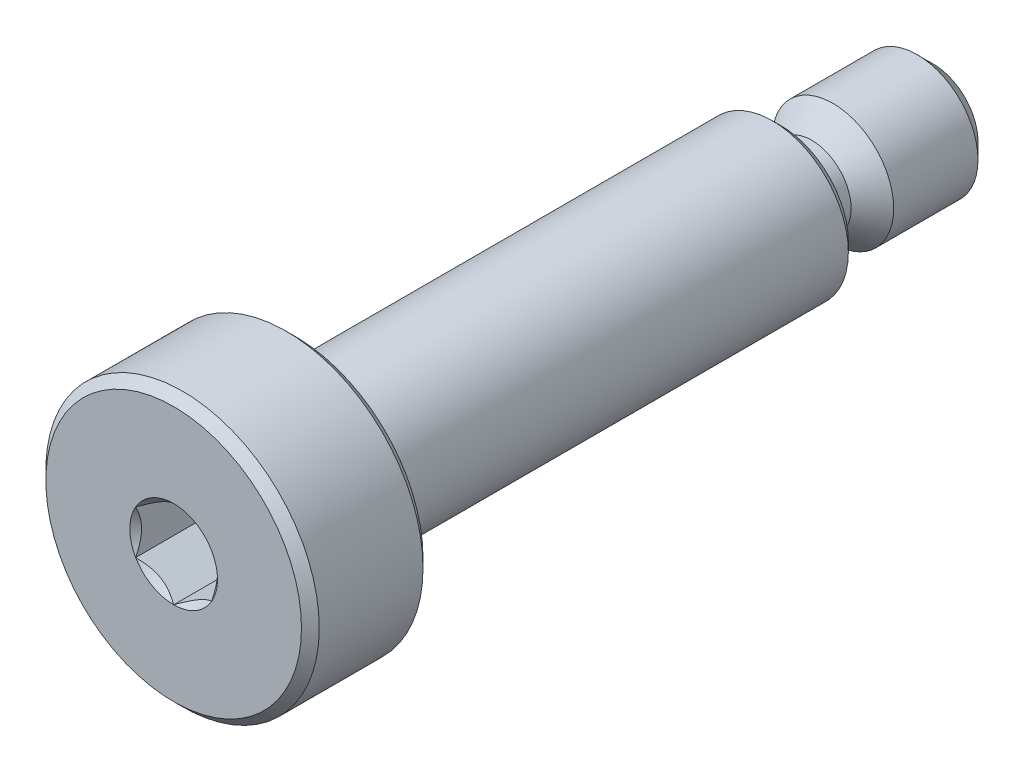
ISO-10303-21;
HEADER;
FILE_DESCRIPTION(('STEP AP214'),'2;1');
FILE_NAME('part.step','',(''),(''),'','','');
FILE_SCHEMA(('AUTOMOTIVE_DESIGN { 1 0 10303 214 1 1 1 1 }'));
ENDSEC;
DATA;
#1=APPLICATION_CONTEXT('core data for automotive mechanical design processes');
#2=APPLICATION_PROTOCOL_DEFINITION('international standard','automotive_design',2000,#1);
#3=PRODUCT_CONTEXT('',#1,'mechanical');
#4=PRODUCT('Part','Part','',(#3));
#5=PRODUCT_RELATED_PRODUCT_CATEGORY('part','',(#4));
#6=PRODUCT_DEFINITION_FORMATION('','',#4);
#7=PRODUCT_DEFINITION_CONTEXT('part definition',#1,'design');
#8=PRODUCT_DEFINITION('design','',#6,#7);
#9=PRODUCT_DEFINITION_SHAPE('','',#8);
#10=(LENGTH_UNIT() NAMED_UNIT(*) SI_UNIT(.MILLI.,.METRE.));
#11=(NAMED_UNIT(*) PLANE_ANGLE_UNIT() SI_UNIT($,.RADIAN.));
#12=(NAMED_UNIT(*) SI_UNIT($,.STERADIAN.) SOLID_ANGLE_UNIT());
#13=UNCERTAINTY_MEASURE_WITH_UNIT(LENGTH_MEASURE(1.E-05),#10,'distance_accuracy_value','');
#14=(GEOMETRIC_REPRESENTATION_CONTEXT(3) GLOBAL_UNCERTAINTY_ASSIGNED_CONTEXT((#13)) GLOBAL_UNIT_ASSIGNED_CONTEXT((#10,
#11,#12)) REPRESENTATION_CONTEXT('',''));
#15=CARTESIAN_POINT('',(0.,0.,0.));
#16=DIRECTION('',(0.,0.,1.));
#17=DIRECTION('',(1.,0.,0.));
#18=AXIS2_PLACEMENT_3D('',#15,#16,#17);
#19=CARTESIAN_POINT('',(0.,1.47500000000001,-12.5));
#20=DIRECTION('',(0.,0.,1.));
#21=DIRECTION('',(1.,0.,0.));
#22=AXIS2_PLACEMENT_3D('',#19,#20,#21);
#23=PLANE('',#22);
#24=CARTESIAN_POINT('',(0.,0.,-12.5));
#25=DIRECTION('',(0.,0.,1.));
#26=DIRECTION('',(1.,0.,0.));
#27=AXIS2_PLACEMENT_3D('',#24,#25,#26);
#28=CIRCLE('',#27,1.47500000000001);
#29=CARTESIAN_POINT('',(1.47500000000001,0.,-12.5));
#30=VERTEX_POINT('',#29);
#31=EDGE_CURVE('E107',#30,#30,#28,.T.);
#32=ORIENTED_EDGE('',*,*,#31,.F.);
#33=EDGE_LOOP('',(#32));
#34=FACE_BOUND('',#33,.T.);
#35=ADVANCED_FACE('F35',(#34),#23,.F.);
#36=CARTESIAN_POINT('',(0.,0.,-12.5));
#37=DIRECTION('',(0.,0.,1.));
#38=DIRECTION('',(1.,0.,0.));
#39=AXIS2_PLACEMENT_3D('',#36,#37,#38);
#40=CONICAL_SURFACE('',#39,1.47500000000001,0.785398163397443);
#41=CARTESIAN_POINT('',(0.,0.,-11.975));
#42=DIRECTION('',(0.,0.,1.));
#43=DIRECTION('',(1.,0.,0.));
#44=AXIS2_PLACEMENT_3D('',#41,#42,#43);
#45=CIRCLE('',#44,2.);
#46=CARTESIAN_POINT('',(2.,0.,-11.975));
#47=VERTEX_POINT('',#46);
#48=EDGE_CURVE('E321',#47,#47,#45,.T.);
#49=ORIENTED_EDGE('',*,*,#48,.F.);
#50=EDGE_LOOP('',(#49));
#51=FACE_BOUND('',#50,.T.);
#52=ORIENTED_EDGE('',*,*,#31,.T.);
#53=EDGE_LOOP('',(#52));
#54=FACE_BOUND('',#53,.T.);
#55=ADVANCED_FACE('F184',(#51,#54),#40,.T.);
#56=CARTESIAN_POINT('',(0.,0.,12.5));
#57=DIRECTION('',(0.,0.,1.));
#58=DIRECTION('',(1.,0.,0.));
#59=AXIS2_PLACEMENT_3D('',#56,#57,#58);
#60=CYLINDRICAL_SURFACE('',#59,2.);
#61=CARTESIAN_POINT('',(0.,0.,-9.2));
#62=DIRECTION('',(0.,0.,1.));
#63=DIRECTION('',(1.,0.,0.));
#64=AXIS2_PLACEMENT_3D('',#61,#62,#63);
#65=CIRCLE('',#64,2.);
#66=CARTESIAN_POINT('',(2.,0.,-9.2));
#67=VERTEX_POINT('',#66);
#68=EDGE_CURVE('E319',#67,#67,#65,.T.);
#69=ORIENTED_EDGE('',*,*,#68,.F.);
#70=EDGE_LOOP('',(#69));
#71=FACE_BOUND('',#70,.T.);
#72=ORIENTED_EDGE('',*,*,#48,.T.);
#73=EDGE_LOOP('',(#72));
#74=FACE_BOUND('',#73,.T.);
#75=ADVANCED_FACE('F189',(#71,#74),#60,.T.);
#76=CARTESIAN_POINT('',(0.,0.,-9.2));
#77=DIRECTION('',(0.,0.,-1.));
#78=DIRECTION('',(-1.,0.,0.));
#79=AXIS2_PLACEMENT_3D('',#76,#77,#78);
#80=CONICAL_SURFACE('',#79,2.,0.785398163397452);
#81=CARTESIAN_POINT('',(0.,0.,-8.5));
#82=DIRECTION('',(0.,0.,1.));
#83=DIRECTION('',(1.,0.,0.));
#84=AXIS2_PLACEMENT_3D('',#81,#82,#83);
#85=CIRCLE('',#84,1.3);
#86=CARTESIAN_POINT('',(1.3,0.,-8.5));
#87=VERTEX_POINT('',#86);
#88=EDGE_CURVE('E316',#87,#87,#85,.T.);
#89=ORIENTED_EDGE('',*,*,#88,.F.);
#90=EDGE_LOOP('',(#89));
#91=FACE_BOUND('',#90,.T.);
#92=ORIENTED_EDGE('',*,*,#68,.T.);
#93=EDGE_LOOP('',(#92));
#94=FACE_BOUND('',#93,.T.);
#95=ADVANCED_FACE('F196',(#91,#94),#80,.T.);
#96=CARTESIAN_POINT('',(0.,0.,12.5));
#97=DIRECTION('',(0.,0.,1.));
#98=DIRECTION('',(1.,0.,0.));
#99=AXIS2_PLACEMENT_3D('',#96,#97,#98);
#100=CYLINDRICAL_SURFACE('',#99,1.3);
#101=CARTESIAN_POINT('',(0.,0.,-7.85));
#102=DIRECTION('',(0.,0.,1.));
#103=DIRECTION('',(1.,0.,0.));
#104=AXIS2_PLACEMENT_3D('',#101,#102,#103);
#105=CIRCLE('',#104,1.3);
#106=CARTESIAN_POINT('',(1.3,0.,-7.85));
#107=VERTEX_POINT('',#106);
#108=EDGE_CURVE('E313',#107,#107,#105,.T.);
#109=ORIENTED_EDGE('',*,*,#108,.F.);
#110=EDGE_LOOP('',(#109));
#111=FACE_BOUND('',#110,.T.);
#112=ORIENTED_EDGE('',*,*,#88,.T.);
#113=EDGE_LOOP('',(#112));
#114=FACE_BOUND('',#113,.T.);
#115=ADVANCED_FACE('F200',(#111,#114),#100,.T.);
#116=CARTESIAN_POINT('',(0.,0.,-7.85));
#117=DIRECTION('',(0.,0.,1.));
#118=DIRECTION('',(1.,0.,0.));
#119=AXIS2_PLACEMENT_3D('',#116,#117,#118);
#120=TOROIDAL_SURFACE('',#119,1.65,0.35);
#121=CARTESIAN_POINT('',(0.,0.,-7.5));
#122=DIRECTION('',(0.,0.,1.));
#123=DIRECTION('',(1.,0.,0.));
#124=AXIS2_PLACEMENT_3D('',#121,#122,#123);
#125=CIRCLE('',#124,1.65);
#126=CARTESIAN_POINT('',(1.65,0.,-7.5));
#127=VERTEX_POINT('',#126);
#128=EDGE_CURVE('E310',#127,#127,#125,.T.);
#129=ORIENTED_EDGE('',*,*,#128,.F.);
#130=EDGE_LOOP('',(#129));
#131=FACE_BOUND('',#130,.T.);
#132=ORIENTED_EDGE('',*,*,#108,.T.);
#133=EDGE_LOOP('',(#132));
#134=FACE_BOUND('',#133,.T.);
#135=ADVANCED_FACE('F204',(#131,#134),#120,.F.);
#136=CARTESIAN_POINT('',(0.,2.5,-7.5));
#137=DIRECTION('',(0.,0.,1.));
#138=DIRECTION('',(1.,0.,0.));
#139=AXIS2_PLACEMENT_3D('',#136,#137,#138);
#140=PLANE('',#139);
#141=CARTESIAN_POINT('',(0.,0.,-7.5));
#142=DIRECTION('',(0.,0.,1.));
#143=DIRECTION('',(1.,0.,0.));
#144=AXIS2_PLACEMENT_3D('',#141,#142,#143);
#145=CIRCLE('',#144,2.2075);
#146=CARTESIAN_POINT('',(2.2075,0.,-7.5));
#147=VERTEX_POINT('',#146);
#148=EDGE_CURVE('E11',#147,#147,#145,.F.);
#149=ORIENTED_EDGE('',*,*,#148,.T.);
#150=EDGE_LOOP('',(#149));
#151=FACE_BOUND('',#150,.T.);
#152=ORIENTED_EDGE('',*,*,#128,.T.);
#153=EDGE_LOOP('',(#152));
#154=FACE_BOUND('',#153,.T.);
#155=ADVANCED_FACE('F208',(#151,#154),#140,.F.);
#156=CARTESIAN_POINT('',(0.,0.,12.5));
#157=DIRECTION('',(0.,0.,1.));
#158=DIRECTION('',(1.,0.,0.));
#159=AXIS2_PLACEMENT_3D('',#156,#157,#158);
#160=CYLINDRICAL_SURFACE('',#159,2.5);
#161=CARTESIAN_POINT('',(0.,0.,-7.2075));
#162=DIRECTION('',(0.,0.,1.));
#163=DIRECTION('',(1.,0.,0.));
#164=AXIS2_PLACEMENT_3D('',#161,#162,#163);
#165=CIRCLE('',#164,2.5);
#166=CARTESIAN_POINT('',(2.5,0.,-7.2075));
#167=VERTEX_POINT('',#166);
#168=EDGE_CURVE('E43',#167,#167,#165,.T.);
#169=ORIENTED_EDGE('',*,*,#168,.T.);
#170=EDGE_LOOP('',(#169));
#171=FACE_BOUND('',#170,.T.);
#172=CARTESIAN_POINT('',(0.,0.,7.789));
#173=DIRECTION('',(0.,0.,1.));
#174=DIRECTION('',(1.,0.,0.));
#175=AXIS2_PLACEMENT_3D('',#172,#173,#174);
#176=CIRCLE('',#175,2.5);
#177=CARTESIAN_POINT('',(2.5,0.,7.789));
#178=VERTEX_POINT('',#177);
#179=EDGE_CURVE('E307',#178,#178,#176,.T.);
#180=ORIENTED_EDGE('',*,*,#179,.F.);
#181=EDGE_LOOP('',(#180));
#182=FACE_BOUND('',#181,.T.);
#183=ADVANCED_FACE('F173',(#171,#182),#160,.T.);
#184=CARTESIAN_POINT('',(0.,0.,7.789));
#185=DIRECTION('',(0.,0.,-1.));
#186=DIRECTION('',(-1.,0.,0.));
#187=AXIS2_PLACEMENT_3D('',#184,#185,#186);
#188=CONICAL_SURFACE('',#187,2.5,0.785398163397453);
#189=CARTESIAN_POINT('',(0.,0.,7.992));
#190=DIRECTION('',(0.,0.,1.));
#191=DIRECTION('',(1.,0.,0.));
#192=AXIS2_PLACEMENT_3D('',#189,#190,#191);
#193=CIRCLE('',#192,2.297);
#194=CARTESIAN_POINT('',(2.297,0.,7.992));
#195=VERTEX_POINT('',#194);
#196=EDGE_CURVE('E304',#195,#195,#193,.T.);
#197=ORIENTED_EDGE('',*,*,#196,.F.);
#198=EDGE_LOOP('',(#197));
#199=FACE_BOUND('',#198,.T.);
#200=ORIENTED_EDGE('',*,*,#179,.T.);
#201=EDGE_LOOP('',(#200));
#202=FACE_BOUND('',#201,.T.);
#203=ADVANCED_FACE('F215',(#199,#202),#188,.T.);
#204=CARTESIAN_POINT('',(0.,0.,12.5));
#205=DIRECTION('',(0.,0.,1.));
#206=DIRECTION('',(1.,0.,0.));
#207=AXIS2_PLACEMENT_3D('',#204,#205,#206);
#208=CYLINDRICAL_SURFACE('',#207,2.297);
#209=CARTESIAN_POINT('',(0.,0.,8.5));
#210=DIRECTION('',(0.,0.,1.));
#211=DIRECTION('',(1.,0.,0.));
#212=AXIS2_PLACEMENT_3D('',#209,#210,#211);
#213=CIRCLE('',#212,2.297);
#214=CARTESIAN_POINT('',(2.297,0.,8.5));
#215=VERTEX_POINT('',#214);
#216=EDGE_CURVE('E301',#215,#215,#213,.T.);
#217=ORIENTED_EDGE('',*,*,#216,.F.);
#218=EDGE_LOOP('',(#217));
#219=FACE_BOUND('',#218,.T.);
#220=ORIENTED_EDGE('',*,*,#196,.T.);
#221=EDGE_LOOP('',(#220));
#222=FACE_BOUND('',#221,.T.);
#223=ADVANCED_FACE('F218',(#219,#222),#208,.T.);
#224=CARTESIAN_POINT('',(0.,4.2075,8.5));
#225=DIRECTION('',(0.,0.,1.));
#226=DIRECTION('',(1.,0.,0.));
#227=AXIS2_PLACEMENT_3D('',#224,#225,#226);
#228=PLANE('',#227);
#229=CARTESIAN_POINT('',(0.,0.,8.5));
#230=DIRECTION('',(0.,0.,1.));
#231=DIRECTION('',(1.,0.,0.));
#232=AXIS2_PLACEMENT_3D('',#229,#230,#231);
#233=CIRCLE('',#232,4.2075);
#234=CARTESIAN_POINT('',(4.2075,0.,8.5));
#235=VERTEX_POINT('',#234);
#236=EDGE_CURVE('E298',#235,#235,#233,.T.);
#237=ORIENTED_EDGE('',*,*,#236,.F.);
#238=EDGE_LOOP('',(#237));
#239=FACE_BOUND('',#238,.T.);
#240=ORIENTED_EDGE('',*,*,#216,.T.);
#241=EDGE_LOOP('',(#240));
#242=FACE_BOUND('',#241,.T.);
#243=ADVANCED_FACE('F222',(#239,#242),#228,.F.);
#244=CARTESIAN_POINT('',(0.,0.,8.5));
#245=DIRECTION('',(0.,0.,1.));
#246=DIRECTION('',(1.,0.,0.));
#247=AXIS2_PLACEMENT_3D('',#244,#245,#246);
#248=CONICAL_SURFACE('',#247,4.2075,0.785398163397444);
#249=CARTESIAN_POINT('',(0.,0.,8.7925));
#250=DIRECTION('',(0.,0.,1.));
#251=DIRECTION('',(1.,0.,0.));
#252=AXIS2_PLACEMENT_3D('',#249,#250,#251);
#253=CIRCLE('',#252,4.5);
#254=CARTESIAN_POINT('',(4.5,0.,8.7925));
#255=VERTEX_POINT('',#254);
#256=EDGE_CURVE('E295',#255,#255,#253,.T.);
#257=ORIENTED_EDGE('',*,*,#256,.F.);
#258=EDGE_LOOP('',(#257));
#259=FACE_BOUND('',#258,.T.);
#260=ORIENTED_EDGE('',*,*,#236,.T.);
#261=EDGE_LOOP('',(#260));
#262=FACE_BOUND('',#261,.T.);
#263=ADVANCED_FACE('F226',(#259,#262),#248,.T.);
#264=CARTESIAN_POINT('',(0.,0.,12.5));
#265=DIRECTION('',(0.,0.,1.));
#266=DIRECTION('',(1.,0.,0.));
#267=AXIS2_PLACEMENT_3D('',#264,#265,#266);
#268=CYLINDRICAL_SURFACE('',#267,4.5);
#269=CARTESIAN_POINT('',(0.,0.,12.2075));
#270=DIRECTION('',(0.,0.,1.));
#271=DIRECTION('',(1.,0.,0.));
#272=AXIS2_PLACEMENT_3D('',#269,#270,#271);
#273=CIRCLE('',#272,4.5);
#274=CARTESIAN_POINT('',(4.5,0.,12.2075));
#275=VERTEX_POINT('',#274);
#276=EDGE_CURVE('E292',#275,#275,#273,.T.);
#277=ORIENTED_EDGE('',*,*,#276,.F.);
#278=EDGE_LOOP('',(#277));
#279=FACE_BOUND('',#278,.T.);
#280=ORIENTED_EDGE('',*,*,#256,.T.);
#281=EDGE_LOOP('',(#280));
#282=FACE_BOUND('',#281,.T.);
#283=ADVANCED_FACE('F230',(#279,#282),#268,.T.);
#284=CARTESIAN_POINT('',(0.,0.,12.2075));
#285=DIRECTION('',(0.,0.,-1.));
#286=DIRECTION('',(-1.,0.,0.));
#287=AXIS2_PLACEMENT_3D('',#284,#285,#286);
#288=CONICAL_SURFACE('',#287,4.5,0.785398163397453);
#289=CARTESIAN_POINT('',(0.,0.,12.5));
#290=DIRECTION('',(0.,0.,1.));
#291=DIRECTION('',(1.,0.,0.));
#292=AXIS2_PLACEMENT_3D('',#289,#290,#291);
#293=CIRCLE('',#292,4.2075);
#294=CARTESIAN_POINT('',(4.2075,0.,12.5));
#295=VERTEX_POINT('',#294);
#296=EDGE_CURVE('E289',#295,#295,#293,.T.);
#297=ORIENTED_EDGE('',*,*,#296,.F.);
#298=EDGE_LOOP('',(#297));
#299=FACE_BOUND('',#298,.T.);
#300=ORIENTED_EDGE('',*,*,#276,.T.);
#301=EDGE_LOOP('',(#300));
#302=FACE_BOUND('',#301,.T.);
#303=ADVANCED_FACE('F234',(#299,#302),#288,.T.);
#304=CARTESIAN_POINT('',(0.,0.,12.5));
#305=DIRECTION('',(0.,0.,-1.));
#306=DIRECTION('',(-1.,0.,0.));
#307=AXIS2_PLACEMENT_3D('',#304,#305,#306);
#308=PLANE('',#307);
#309=CARTESIAN_POINT('',(0.,0.,12.5));
#310=DIRECTION('',(0.,0.,1.));
#311=DIRECTION('',(1.,0.,0.));
#312=AXIS2_PLACEMENT_3D('',#309,#310,#311);
#313=CIRCLE('',#312,1.44337567297406);
#314=CARTESIAN_POINT('',(-1.25,0.721687836487032,12.5));
#315=VERTEX_POINT('',#314);
#316=CARTESIAN_POINT('',(-1.25,-0.721687836487033,12.5));
#317=VERTEX_POINT('',#316);
#318=EDGE_CURVE('E130',#315,#317,#313,.T.);
#319=ORIENTED_EDGE('',*,*,#318,.F.);
#320=CARTESIAN_POINT('',(0.,1.44337567297406,12.5));
#321=VERTEX_POINT('',#320);
#322=EDGE_CURVE('E97',#321,#315,#313,.T.);
#323=ORIENTED_EDGE('',*,*,#322,.F.);
#324=CARTESIAN_POINT('',(1.25,0.72168783648703,12.5));
#325=VERTEX_POINT('',#324);
#326=EDGE_CURVE('E88',#325,#321,#313,.T.);
#327=ORIENTED_EDGE('',*,*,#326,.F.);
#328=CARTESIAN_POINT('',(1.25,-0.721687836487032,12.5));
#329=VERTEX_POINT('',#328);
#330=EDGE_CURVE('E49',#329,#325,#313,.T.);
#331=ORIENTED_EDGE('',*,*,#330,.F.);
#332=CARTESIAN_POINT('',(0.,-1.44337567297407,12.5));
#333=VERTEX_POINT('',#332);
#334=EDGE_CURVE('E56',#333,#329,#313,.T.);
#335=ORIENTED_EDGE('',*,*,#334,.F.);
#336=EDGE_CURVE('E131',#317,#333,#313,.T.);
#337=ORIENTED_EDGE('',*,*,#336,.F.);
#338=EDGE_LOOP('',(#319,#323,#327,#331,#335,#337));
#339=FACE_BOUND('',#338,.T.);
#340=ORIENTED_EDGE('',*,*,#296,.T.);
#341=EDGE_LOOP('',(#340));
#342=FACE_BOUND('',#341,.T.);
#343=ADVANCED_FACE('F127',(#339,#342),#308,.F.);
#344=CARTESIAN_POINT('',(0.,0.,12.5));
#345=DIRECTION('',(0.,0.,1.));
#346=DIRECTION('',(1.,0.,0.));
#347=AXIS2_PLACEMENT_3D('',#344,#345,#346);
#348=CONICAL_SURFACE('',#347,1.44337567297406,0.78539816339745);
#349=ORIENTED_EDGE('',*,*,#322,.T.);
#350=CARTESIAN_POINT('',(0.000199999999998974,1.4434911430279,12.5001154839091));
#351=CARTESIAN_POINT('',(-0.0427751670715874,1.41867941875065,12.4753216680551));
#352=CARTESIAN_POINT('',(-0.0864690047459487,1.39345276980743,12.4519837344187));
#353=CARTESIAN_POINT('',(-0.175565930841942,1.34201263554194,12.4092520040845));
#354=CARTESIAN_POINT('',(-0.220977498357064,1.31579425481276,12.3898819923604));
#355=CARTESIAN_POINT('',(-0.31254782093526,1.26292610442246,12.3567004834135));
#356=CARTESIAN_POINT('',(-0.358683240175885,1.23628980770471,12.3428055590527));
#357=CARTESIAN_POINT('',(-0.451970080407591,1.18243062538508,12.3213972821606));
#358=CARTESIAN_POINT('',(-0.499118649136379,1.15520938653761,12.3138679415668));
#359=CARTESIAN_POINT('',(-0.580373556887251,1.10829684367467,12.3070744980507));
#360=CARTESIAN_POINT('',(-0.61437487662794,1.08866617256958,12.3060685591044));
#361=CARTESIAN_POINT('',(-0.682317764432476,1.04943932800611,12.3077614149113));
#362=CARTESIAN_POINT('',(-0.716259317655656,1.02984316311599,12.3104610272155));
#363=CARTESIAN_POINT('',(-0.783814856457498,0.9908399546035,12.3194089303164));
#364=CARTESIAN_POINT('',(-0.817428507286774,0.971433104248772,12.3256605258997));
#365=CARTESIAN_POINT('',(-0.884094638217812,0.932943395609906,12.3413756814139));
#366=CARTESIAN_POINT('',(-0.917146871030294,0.913860680098301,12.3508406200875));
#367=CARTESIAN_POINT('',(-1.00179969160026,0.864986351354568,12.3789313906876));
#368=CARTESIAN_POINT('',(-1.05286649242964,0.835502920149076,12.3996701574522));
#369=CARTESIAN_POINT('',(-1.15300085411325,0.777690319475908,12.4463871346715));
#370=CARTESIAN_POINT('',(-1.20207431157827,0.749357745598416,12.4723482959468));
#371=CARTESIAN_POINT('',(-1.2502,0.721572366433194,12.5001154839091));
#372=B_SPLINE_CURVE_WITH_KNOTS('',3,(#350,#351,#352,#353,#354,#355,#356,#357,#358,#359,#360,
#361,#362,#363,#364,#365,#366,#367,#368,#369,#370,#371),.UNSPECIFIED.,.F.,.F.,(4,2,2,2,2,2,2,2,
2,2,4),(0.,0.166533409618303,0.334037607289761,0.498880396489696,0.663307919240272,
0.780963963458824,0.898645970148451,1.01643764860773,1.13427993171549,1.32148652032141,
1.50809158792574),.UNSPECIFIED.);
#373=EDGE_CURVE('E102',#321,#315,#372,.T.);
#374=ORIENTED_EDGE('',*,*,#373,.F.);
#375=EDGE_LOOP('',(#349,#374));
#376=FACE_BOUND('',#375,.T.);
#377=ADVANCED_FACE('F103',(#376),#348,.F.);
#378=ORIENTED_EDGE('',*,*,#318,.T.);
#379=CARTESIAN_POINT('',(-1.25,-1.43934010808077,12.9629820968923));
#380=CARTESIAN_POINT('',(-1.25,-1.40429313005659,12.9365249226329));
#381=CARTESIAN_POINT('',(-1.25,-1.36905087135599,12.9103271603543));
#382=CARTESIAN_POINT('',(-1.25,-1.29809650706311,12.8585575718396));
#383=CARTESIAN_POINT('',(-1.25,-1.26238428576495,12.8329859043563));
#384=CARTESIAN_POINT('',(-1.25,-1.15390111792708,12.7570059936895));
#385=CARTESIAN_POINT('',(-1.25,-1.08031646726264,12.7077402861896));
#386=CARTESIAN_POINT('',(-1.25,-0.926012322755096,12.6110258302631));
#387=CARTESIAN_POINT('',(-1.25,-0.845125318656147,12.5638412989418));
#388=CARTESIAN_POINT('',(-1.25,-0.679311174076602,12.4775307343904));
#389=CARTESIAN_POINT('',(-1.25,-0.594398891026687,12.4383775346269));
#390=CARTESIAN_POINT('',(-1.25,-0.46694481246074,12.3904772236883));
#391=CARTESIAN_POINT('',(-1.25,-0.426289985812822,12.3767294897863));
#392=CARTESIAN_POINT('',(-1.25,-0.343998850091268,12.3524979274505));
#393=CARTESIAN_POINT('',(-1.25,-0.302362473614962,12.3420143238698));
#394=CARTESIAN_POINT('',(-1.25,-0.219052696285666,12.3250301617483));
#395=CARTESIAN_POINT('',(-1.25,-0.1773934284745,12.3184613604714));
#396=CARTESIAN_POINT('',(-1.25,-0.0936293693401926,12.3094350534578));
#397=CARTESIAN_POINT('',(-1.25,-0.0515246558543966,12.3069768409973));
#398=CARTESIAN_POINT('',(-1.25,0.031189057630631,12.3063540620133));
#399=CARTESIAN_POINT('',(-1.25,0.0717969625499299,12.3080371168462));
#400=CARTESIAN_POINT('',(-1.25,0.152668636885197,12.3152682705979));
#401=CARTESIAN_POINT('',(-1.25,0.192932338835358,12.3208171104131));
#402=CARTESIAN_POINT('',(-1.25,0.273499879165295,12.335571036465));
#403=CARTESIAN_POINT('',(-1.25,0.313792180618511,12.3448381759641));
#404=CARTESIAN_POINT('',(-1.25,0.393496413911457,12.3665361784573));
#405=CARTESIAN_POINT('',(-1.25,0.432908419115059,12.3789667767306));
#406=CARTESIAN_POINT('',(-1.25,0.556992735862298,12.4227793529314));
#407=CARTESIAN_POINT('',(-1.25,0.639898924666085,12.459151072876));
#408=CARTESIAN_POINT('',(-1.25,0.801816555499701,12.5400191621783));
#409=CARTESIAN_POINT('',(-1.25,0.880812666325044,12.584544720912));
#410=CARTESIAN_POINT('',(-1.25,1.0317856127975,12.6764048766666));
#411=CARTESIAN_POINT('',(-1.25,1.10391618485086,12.7234899339163));
#412=CARTESIAN_POINT('',(-1.25,1.21018606043311,12.7962785615985));
#413=CARTESIAN_POINT('',(-1.25,1.24515069969379,12.8207980853934));
#414=CARTESIAN_POINT('',(-1.25,1.31460220852737,12.8704856367657));
#415=CARTESIAN_POINT('',(-1.25,1.34908920596618,12.8956534854155));
#416=CARTESIAN_POINT('',(-1.25,1.38337731682912,12.9210901488412));
#417=B_SPLINE_CURVE_WITH_KNOTS('',3,(#379,#380,#381,#382,#383,#384,#385,#386,#387,#388,#389,
#390,#391,#392,#393,#394,#395,#396,#397,#398,#399,#400,#401,#402,#403,#404,#405,#406,#407,#408,
#409,#410,#411,#412,#413,#414,#415,#416),.UNSPECIFIED.,.F.,.F.,(4,2,2,2,2,2,2,2,2,2,2,2,2,2,2,2,
2,2,4),(0.,0.131732960381448,0.263498984161645,0.529042014455825,0.809741926134618,
1.08947609717225,1.21811634272577,1.346765447839,1.47310084517844,1.59941451973784,
1.72115042167849,1.84290966131735,1.96679153905342,2.09066305366039,2.36146692896009,
2.63325989198491,2.89154668212279,3.01965734507713,3.14773302245628),.UNSPECIFIED.);
#418=EDGE_CURVE('E96',#315,#317,#417,.F.);
#419=ORIENTED_EDGE('',*,*,#418,.F.);
#420=EDGE_LOOP('',(#378,#419));
#421=FACE_BOUND('',#420,.T.);
#422=ADVANCED_FACE('F242',(#421),#348,.F.);
#423=ORIENTED_EDGE('',*,*,#336,.T.);
#424=CARTESIAN_POINT('',(-1.2502,-0.721572366433195,12.5001154839091));
#425=CARTESIAN_POINT('',(-1.20722483292841,-0.746384090710445,12.4753216680551));
#426=CARTESIAN_POINT('',(-1.16353099525405,-0.771610739653665,12.4519837344187));
#427=CARTESIAN_POINT('',(-1.07443406915806,-0.823050873919156,12.4092520040845));
#428=CARTESIAN_POINT('',(-1.02902250164294,-0.849269254648334,12.3898819923604));
#429=CARTESIAN_POINT('',(-0.937452179064739,-0.902137405038637,12.3567004834135));
#430=CARTESIAN_POINT('',(-0.891316759824113,-0.928773701756388,12.3428055590527));
#431=CARTESIAN_POINT('',(-0.798029919592407,-0.982632884076014,12.3213972821606));
#432=CARTESIAN_POINT('',(-0.750881350863619,-1.00985412292348,12.3138679415668));
#433=CARTESIAN_POINT('',(-0.669626443112747,-1.05676666578643,12.3070744980507));
#434=CARTESIAN_POINT('',(-0.635625123372058,-1.07639733689152,12.3060685591044));
#435=CARTESIAN_POINT('',(-0.567682235567522,-1.11562418145499,12.3077614149113));
#436=CARTESIAN_POINT('',(-0.533740682344342,-1.1352203463451,12.3104610272155));
#437=CARTESIAN_POINT('',(-0.4661851435425,-1.1742235548576,12.3194089303164));
#438=CARTESIAN_POINT('',(-0.432571492713224,-1.19363040521233,12.3256605258997));
#439=CARTESIAN_POINT('',(-0.365905361782186,-1.23212011385119,12.3413756814139));
#440=CARTESIAN_POINT('',(-0.332853128969704,-1.2512028293628,12.3508406200875));
#441=CARTESIAN_POINT('',(-0.248200308399735,-1.30007715810653,12.3789313906876));
#442=CARTESIAN_POINT('',(-0.197133507570362,-1.32956058931202,12.3996701574522));
#443=CARTESIAN_POINT('',(-0.096999145886745,-1.38737318998519,12.4463871346715));
#444=CARTESIAN_POINT('',(-0.04792568842173,-1.41570576386268,12.4723482959468));
#445=CARTESIAN_POINT('',(0.00020000000000096,-1.4434911430279,12.5001154839091));
#446=B_SPLINE_CURVE_WITH_KNOTS('',3,(#424,#425,#426,#427,#428,#429,#430,#431,#432,#433,#434,
#435,#436,#437,#438,#439,#440,#441,#442,#443,#444,#445),.UNSPECIFIED.,.F.,.F.,(4,2,2,2,2,2,2,2,
2,2,4),(0.,0.166533409618304,0.334037607289762,0.498880396489699,0.663307919240275,
0.780963963458827,0.898645970148453,1.01643764860773,1.1342799317155,1.32148652032141,
1.50809158792574),.UNSPECIFIED.);
#447=EDGE_CURVE('E141',#317,#333,#446,.T.);
#448=ORIENTED_EDGE('',*,*,#447,.F.);
#449=EDGE_LOOP('',(#423,#448));
#450=FACE_BOUND('',#449,.T.);
#451=ADVANCED_FACE('F246',(#450),#348,.F.);
#452=ORIENTED_EDGE('',*,*,#334,.T.);
#453=CARTESIAN_POINT('',(-0.000199999999999157,-1.4434911430279,12.5001154839091));
#454=CARTESIAN_POINT('',(0.0427751670715877,-1.41867941875065,12.4753216680551));
#455=CARTESIAN_POINT('',(0.0864690047459492,-1.39345276980743,12.4519837344187));
#456=CARTESIAN_POINT('',(0.175565930841943,-1.34201263554194,12.4092520040845));
#457=CARTESIAN_POINT('',(0.220977498357065,-1.31579425481276,12.3898819923604));
#458=CARTESIAN_POINT('',(0.312547820935261,-1.26292610442246,12.3567004834135));
#459=CARTESIAN_POINT('',(0.358683240175887,-1.23628980770471,12.3428055590527));
#460=CARTESIAN_POINT('',(0.451970080407594,-1.18243062538508,12.3213972821606));
#461=CARTESIAN_POINT('',(0.499118649136381,-1.15520938653761,12.3138679415668));
#462=CARTESIAN_POINT('',(0.580373556887254,-1.10829684367467,12.3070744980507));
#463=CARTESIAN_POINT('',(0.614374876627942,-1.08866617256958,12.3060685591044));
#464=CARTESIAN_POINT('',(0.682317764432479,-1.04943932800611,12.3077614149113));
#465=CARTESIAN_POINT('',(0.716259317655659,-1.02984316311599,12.3104610272155));
#466=CARTESIAN_POINT('',(0.783814856457501,-0.990839954603499,12.3194089303164));
#467=CARTESIAN_POINT('',(0.817428507286776,-0.971433104248771,12.3256605258997));
#468=CARTESIAN_POINT('',(0.884094638217814,-0.932943395609905,12.3413756814139));
#469=CARTESIAN_POINT('',(0.917146871030297,-0.9138606800983,12.3508406200875));
#470=CARTESIAN_POINT('',(1.00179969160027,-0.864986351354567,12.3789313906876));
#471=CARTESIAN_POINT('',(1.05286649242964,-0.835502920149075,12.3996701574522));
#472=CARTESIAN_POINT('',(1.15300085411326,-0.777690319475908,12.4463871346715));
#473=CARTESIAN_POINT('',(1.20207431157827,-0.749357745598417,12.4723482959468));
#474=CARTESIAN_POINT('',(1.2502,-0.721572366433194,12.5001154839091));
#475=B_SPLINE_CURVE_WITH_KNOTS('',3,(#453,#454,#455,#456,#457,#458,#459,#460,#461,#462,#463,
#464,#465,#466,#467,#468,#469,#470,#471,#472,#473,#474),.UNSPECIFIED.,.F.,.F.,(4,2,2,2,2,2,2,2,
2,2,4),(0.,0.166533409618304,0.334037607289762,0.498880396489699,0.663307919240275,
0.780963963458827,0.898645970148453,1.01643764860773,1.1342799317155,1.32148652032141,
1.50809158792573),.UNSPECIFIED.);
#476=EDGE_CURVE('E268',#333,#329,#475,.T.);
#477=ORIENTED_EDGE('',*,*,#476,.F.);
#478=EDGE_LOOP('',(#452,#477));
#479=FACE_BOUND('',#478,.T.);
#480=ADVANCED_FACE('F255',(#479),#348,.F.);
#481=ORIENTED_EDGE('',*,*,#330,.T.);
#482=CARTESIAN_POINT('',(1.25,-1.43934010829019,12.9629820970504));
#483=CARTESIAN_POINT('',(1.25,-1.40429313026013,12.9365249227849));
#484=CARTESIAN_POINT('',(1.25,-1.36905087155364,12.9103271605002));
#485=CARTESIAN_POINT('',(1.25,-1.29809650724891,12.8585575719734));
#486=CARTESIAN_POINT('',(1.25,-1.2623842859448,12.8329859044841));
#487=CARTESIAN_POINT('',(1.25,-1.1539011180887,12.757005993799));
#488=CARTESIAN_POINT('',(1.25,-1.08031646741187,12.707740286287));
#489=CARTESIAN_POINT('',(1.25,-0.926012322877302,12.6110258303356));
#490=CARTESIAN_POINT('',(1.25,-0.845125318763648,12.5638412990016));
#491=CARTESIAN_POINT('',(1.25,-0.679311174153443,12.4775307344266));
#492=CARTESIAN_POINT('',(1.25,-0.594398891087583,12.4383775346522));
#493=CARTESIAN_POINT('',(1.25,-0.466944812509639,12.3904772237056));
#494=CARTESIAN_POINT('',(1.25,-0.426289985866745,12.3767294898039));
#495=CARTESIAN_POINT('',(1.25,-0.343998850155403,12.3524979274677));
#496=CARTESIAN_POINT('',(1.25,-0.302362473684286,12.3420143238863));
#497=CARTESIAN_POINT('',(1.25,-0.219052696365195,12.3250301617622));
#498=CARTESIAN_POINT('',(1.25,-0.177393428559044,12.3184613604834));
#499=CARTESIAN_POINT('',(1.25,-0.093629369434598,12.309435053465));
#500=CARTESIAN_POINT('',(1.25,-0.0515246559536487,12.3069768410015));
#501=CARTESIAN_POINT('',(1.25,0.0311890575224388,12.3063540620107));
#502=CARTESIAN_POINT('',(1.25,0.071796962437632,12.3080371168399));
#503=CARTESIAN_POINT('',(1.25,0.152668636765093,12.3152682705835));
#504=CARTESIAN_POINT('',(1.25,0.192932338711553,12.3208171103943));
#505=CARTESIAN_POINT('',(1.25,0.273499879034188,12.335571036437));
#506=CARTESIAN_POINT('',(1.25,0.313792180483814,12.3448381759314));
#507=CARTESIAN_POINT('',(1.25,0.393496413769925,12.3665361784149));
#508=CARTESIAN_POINT('',(1.25,0.432908418970282,12.3789667766833));
#509=CARTESIAN_POINT('',(1.25,0.556992735685996,12.4227793528609));
#510=CARTESIAN_POINT('',(1.25,0.639898924463083,12.4591510727842));
#511=CARTESIAN_POINT('',(1.25,0.801816555245347,12.5400191620416));
#512=CARTESIAN_POINT('',(1.25,0.880812666046052,12.5845447207516));
#513=CARTESIAN_POINT('',(1.25,1.03178561247421,12.676404876461));
#514=CARTESIAN_POINT('',(1.25,1.10391618450775,12.7234899336892));
#515=CARTESIAN_POINT('',(1.25,1.2101860600607,12.7962785613395));
#516=CARTESIAN_POINT('',(1.25,1.24515069931176,12.8207980851238));
#517=CARTESIAN_POINT('',(1.25,1.31460220812614,12.8704856364749));
#518=CARTESIAN_POINT('',(1.25,1.34908920555539,12.8956534851142));
#519=CARTESIAN_POINT('',(1.25,1.38337731640878,12.9210901485293));
#520=B_SPLINE_CURVE_WITH_KNOTS('',3,(#482,#483,#484,#485,#486,#487,#488,#489,#490,#491,#492,
#493,#494,#495,#496,#497,#498,#499,#500,#501,#502,#503,#504,#505,#506,#507,#508,#509,#510,#511,
#512,#513,#514,#515,#516,#517,#518,#519),.UNSPECIFIED.,.F.,.F.,(4,2,2,2,2,2,2,2,2,2,2,2,2,2,2,2,
2,2,4),(0.,0.131732960406522,0.263498984211801,0.52904201455708,0.809741926293176,
1.08947609738757,1.21811634292656,1.34676544802529,1.47310084535082,1.59941451989631,
1.72115042182424,1.84290966145034,1.96679153917268,2.09066305376595,2.36146692896707,
2.63325989189266,2.89154668194565,3.01965734485811,3.14773302219539),.UNSPECIFIED.);
#521=EDGE_CURVE('E117',#329,#325,#520,.T.);
#522=ORIENTED_EDGE('',*,*,#521,.F.);
#523=EDGE_LOOP('',(#481,#522));
#524=FACE_BOUND('',#523,.T.);
#525=ADVANCED_FACE('F249',(#524),#348,.F.);
#526=ORIENTED_EDGE('',*,*,#326,.T.);
#527=CARTESIAN_POINT('',(1.2502,0.721572366433195,12.5001154839091));
#528=CARTESIAN_POINT('',(1.20722483292841,0.746384090710444,12.4753216680551));
#529=CARTESIAN_POINT('',(1.16353099525405,0.771610739653665,12.4519837344187));
#530=CARTESIAN_POINT('',(1.07443406915806,0.823050873919155,12.4092520040845));
#531=CARTESIAN_POINT('',(1.02902250164294,0.849269254648333,12.3898819923604));
#532=CARTESIAN_POINT('',(0.937452179064741,0.902137405038635,12.3567004834135));
#533=CARTESIAN_POINT('',(0.891316759824115,0.928773701756387,12.3428055590527));
#534=CARTESIAN_POINT('',(0.798029919592408,0.982632884076012,12.3213972821606));
#535=CARTESIAN_POINT('',(0.750881350863621,1.00985412292348,12.3138679415668));
#536=CARTESIAN_POINT('',(0.669626443112749,1.05676666578643,12.3070744980507));
#537=CARTESIAN_POINT('',(0.63562512337206,1.07639733689152,12.3060685591044));
#538=CARTESIAN_POINT('',(0.567682235567523,1.11562418145499,12.3077614149113));
#539=CARTESIAN_POINT('',(0.533740682344343,1.1352203463451,12.3104610272155));
#540=CARTESIAN_POINT('',(0.466185143542501,1.1742235548576,12.3194089303164));
#541=CARTESIAN_POINT('',(0.432571492713226,1.19363040521232,12.3256605258997));
#542=CARTESIAN_POINT('',(0.365905361782188,1.23212011385119,12.3413756814139));
#543=CARTESIAN_POINT('',(0.332853128969705,1.2512028293628,12.3508406200875));
#544=CARTESIAN_POINT('',(0.248200308399736,1.30007715810653,12.3789313906876));
#545=CARTESIAN_POINT('',(0.197133507570362,1.32956058931202,12.3996701574522));
#546=CARTESIAN_POINT('',(0.0969991458867445,1.38737318998519,12.4463871346715));
#547=CARTESIAN_POINT('',(0.0479256884217297,1.41570576386268,12.4723482959468));
#548=CARTESIAN_POINT('',(-0.000200000000000904,1.4434911430279,12.5001154839091));
#549=B_SPLINE_CURVE_WITH_KNOTS('',3,(#527,#528,#529,#530,#531,#532,#533,#534,#535,#536,#537,
#538,#539,#540,#541,#542,#543,#544,#545,#546,#547,#548),.UNSPECIFIED.,.F.,.F.,(4,2,2,2,2,2,2,2,
2,2,4),(0.,0.166533409618304,0.334037607289761,0.498880396489698,0.663307919240274,
0.780963963458826,0.898645970148452,1.01643764860773,1.13427993171549,1.32148652032141,
1.50809158792574),.UNSPECIFIED.);
#550=EDGE_CURVE('E92',#325,#321,#549,.T.);
#551=ORIENTED_EDGE('',*,*,#550,.F.);
#552=EDGE_LOOP('',(#526,#551));
#553=FACE_BOUND('',#552,.T.);
#554=ADVANCED_FACE('F90',(#553),#348,.F.);
#555=CARTESIAN_POINT('',(0.,0.,10.5));
#556=DIRECTION('',(0.,0.,1.));
#557=DIRECTION('',(1.,0.,0.));
#558=AXIS2_PLACEMENT_3D('',#555,#556,#557);
#559=PLANE('',#558);
#560=DIRECTION('',(-0.866025403784439,0.499999999999999,0.));
#561=VECTOR('',#560,1.);
#562=CARTESIAN_POINT('',(1.25,0.721687836487032,10.5));
#563=LINE('',#562,#561);
#564=CARTESIAN_POINT('',(1.25,0.721687836487032,10.5));
#565=VERTEX_POINT('',#564);
#566=CARTESIAN_POINT('',(0.,1.44337567297406,10.5));
#567=VERTEX_POINT('',#566);
#568=EDGE_CURVE('E116',#565,#567,#563,.T.);
#569=ORIENTED_EDGE('',*,*,#568,.T.);
#570=DIRECTION('',(-0.866025403784438,-0.5,0.));
#571=VECTOR('',#570,1.);
#572=CARTESIAN_POINT('',(0.,1.44337567297406,10.5));
#573=LINE('',#572,#571);
#574=CARTESIAN_POINT('',(-1.25,0.721687836487032,10.5));
#575=VERTEX_POINT('',#574);
#576=EDGE_CURVE('E121',#567,#575,#573,.T.);
#577=ORIENTED_EDGE('',*,*,#576,.T.);
#578=DIRECTION('',(0.,-1.,0.));
#579=VECTOR('',#578,1.);
#580=CARTESIAN_POINT('',(-1.25,0.721687836487032,10.5));
#581=LINE('',#580,#579);
#582=CARTESIAN_POINT('',(-1.25,-0.721687836487033,10.5));
#583=VERTEX_POINT('',#582);
#584=EDGE_CURVE('E354',#575,#583,#581,.T.);
#585=ORIENTED_EDGE('',*,*,#584,.T.);
#586=DIRECTION('',(0.866025403784439,-0.499999999999999,0.));
#587=VECTOR('',#586,1.);
#588=CARTESIAN_POINT('',(-1.25,-0.721687836487033,10.5));
#589=LINE('',#588,#587);
#590=CARTESIAN_POINT('',(0.,-1.44337567297406,10.5));
#591=VERTEX_POINT('',#590);
#592=EDGE_CURVE('E352',#583,#591,#589,.T.);
#593=ORIENTED_EDGE('',*,*,#592,.T.);
#594=DIRECTION('',(0.866025403784438,0.5,0.));
#595=VECTOR('',#594,1.);
#596=CARTESIAN_POINT('',(0.,-1.44337567297406,10.5));
#597=LINE('',#596,#595);
#598=CARTESIAN_POINT('',(1.25,-0.721687836487032,10.5));
#599=VERTEX_POINT('',#598);
#600=EDGE_CURVE('E280',#591,#599,#597,.T.);
#601=ORIENTED_EDGE('',*,*,#600,.T.);
#602=DIRECTION('',(0.,1.,0.));
#603=VECTOR('',#602,1.);
#604=CARTESIAN_POINT('',(1.25,-0.721687836487032,10.5));
#605=LINE('',#604,#603);
#606=EDGE_CURVE('E124',#599,#565,#605,.T.);
#607=ORIENTED_EDGE('',*,*,#606,.T.);
#608=EDGE_LOOP('',(#569,#577,#585,#593,#601,#607));
#609=FACE_BOUND('',#608,.T.);
#610=ADVANCED_FACE('F161',(#609),#559,.T.);
#611=CARTESIAN_POINT('',(0.,1.44337567297406,10.5));
#612=DIRECTION('',(-0.5,0.866025403784438,0.));
#613=DIRECTION('',(-0.866025403784438,-0.5,0.));
#614=AXIS2_PLACEMENT_3D('',#611,#612,#613);
#615=PLANE('',#614);
#616=DIRECTION('',(0.,0.,1.));
#617=VECTOR('',#616,1.);
#618=CARTESIAN_POINT('',(0.,1.44337567297406,10.5));
#619=LINE('',#618,#617);
#620=EDGE_CURVE('E113',#567,#321,#619,.T.);
#621=ORIENTED_EDGE('',*,*,#620,.T.);
#622=ORIENTED_EDGE('',*,*,#373,.T.);
#623=DIRECTION('',(0.,0.,1.));
#624=VECTOR('',#623,1.);
#625=CARTESIAN_POINT('',(-1.25,0.721687836487032,10.5));
#626=LINE('',#625,#624);
#627=EDGE_CURVE('E123',#575,#315,#626,.T.);
#628=ORIENTED_EDGE('',*,*,#627,.F.);
#629=ORIENTED_EDGE('',*,*,#576,.F.);
#630=EDGE_LOOP('',(#621,#622,#628,#629));
#631=FACE_BOUND('',#630,.T.);
#632=ADVANCED_FACE('F119',(#631),#615,.F.);
#633=CARTESIAN_POINT('',(-1.25,0.721687836487032,10.5));
#634=DIRECTION('',(-1.,0.,0.));
#635=DIRECTION('',(0.,0.,1.));
#636=AXIS2_PLACEMENT_3D('',#633,#634,#635);
#637=PLANE('',#636);
#638=ORIENTED_EDGE('',*,*,#627,.T.);
#639=ORIENTED_EDGE('',*,*,#418,.T.);
#640=DIRECTION('',(0.,0.,1.));
#641=VECTOR('',#640,1.);
#642=CARTESIAN_POINT('',(-1.25,-0.721687836487033,10.5));
#643=LINE('',#642,#641);
#644=EDGE_CURVE('E277',#583,#317,#643,.T.);
#645=ORIENTED_EDGE('',*,*,#644,.F.);
#646=ORIENTED_EDGE('',*,*,#584,.F.);
#647=EDGE_LOOP('',(#638,#639,#645,#646));
#648=FACE_BOUND('',#647,.T.);
#649=ADVANCED_FACE('F150',(#648),#637,.F.);
#650=CARTESIAN_POINT('',(-1.25,-0.721687836487033,10.5));
#651=DIRECTION('',(-0.499999999999999,-0.866025403784439,0.));
#652=DIRECTION('',(0.866025403784439,-0.499999999999999,0.));
#653=AXIS2_PLACEMENT_3D('',#650,#651,#652);
#654=PLANE('',#653);
#655=ORIENTED_EDGE('',*,*,#644,.T.);
#656=ORIENTED_EDGE('',*,*,#447,.T.);
#657=DIRECTION('',(0.,0.,1.));
#658=VECTOR('',#657,1.);
#659=CARTESIAN_POINT('',(0.,-1.44337567297406,10.5));
#660=LINE('',#659,#658);
#661=EDGE_CURVE('E275',#591,#333,#660,.T.);
#662=ORIENTED_EDGE('',*,*,#661,.F.);
#663=ORIENTED_EDGE('',*,*,#592,.F.);
#664=EDGE_LOOP('',(#655,#656,#662,#663));
#665=FACE_BOUND('',#664,.T.);
#666=ADVANCED_FACE('F154',(#665),#654,.F.);
#667=CARTESIAN_POINT('',(0.,-1.44337567297406,10.5));
#668=DIRECTION('',(0.5,-0.866025403784438,0.));
#669=DIRECTION('',(0.866025403784438,0.5,0.));
#670=AXIS2_PLACEMENT_3D('',#667,#668,#669);
#671=PLANE('',#670);
#672=ORIENTED_EDGE('',*,*,#661,.T.);
#673=ORIENTED_EDGE('',*,*,#476,.T.);
#674=DIRECTION('',(0.,0.,1.));
#675=VECTOR('',#674,1.);
#676=CARTESIAN_POINT('',(1.25,-0.721687836487032,10.5));
#677=LINE('',#676,#675);
#678=EDGE_CURVE('E282',#599,#329,#677,.T.);
#679=ORIENTED_EDGE('',*,*,#678,.F.);
#680=ORIENTED_EDGE('',*,*,#600,.F.);
#681=EDGE_LOOP('',(#672,#673,#679,#680));
#682=FACE_BOUND('',#681,.T.);
#683=ADVANCED_FACE('F278',(#682),#671,.F.);
#684=CARTESIAN_POINT('',(1.25,-0.721687836487032,10.5));
#685=DIRECTION('',(1.,0.,0.));
#686=DIRECTION('',(0.,1.,0.));
#687=AXIS2_PLACEMENT_3D('',#684,#685,#686);
#688=PLANE('',#687);
#689=ORIENTED_EDGE('',*,*,#678,.T.);
#690=ORIENTED_EDGE('',*,*,#521,.T.);
#691=DIRECTION('',(0.,0.,1.));
#692=VECTOR('',#691,1.);
#693=CARTESIAN_POINT('',(1.25,0.721687836487032,10.5));
#694=LINE('',#693,#692);
#695=EDGE_CURVE('E115',#565,#325,#694,.T.);
#696=ORIENTED_EDGE('',*,*,#695,.F.);
#697=ORIENTED_EDGE('',*,*,#606,.F.);
#698=EDGE_LOOP('',(#689,#690,#696,#697));
#699=FACE_BOUND('',#698,.T.);
#700=ADVANCED_FACE('F181',(#699),#688,.F.);
#701=CARTESIAN_POINT('',(1.25,0.721687836487032,10.5));
#702=DIRECTION('',(0.499999999999999,0.866025403784439,0.));
#703=DIRECTION('',(-0.866025403784439,0.499999999999999,0.));
#704=AXIS2_PLACEMENT_3D('',#701,#702,#703);
#705=PLANE('',#704);
#706=ORIENTED_EDGE('',*,*,#695,.T.);
#707=ORIENTED_EDGE('',*,*,#550,.T.);
#708=ORIENTED_EDGE('',*,*,#620,.F.);
#709=ORIENTED_EDGE('',*,*,#568,.F.);
#710=EDGE_LOOP('',(#706,#707,#708,#709));
#711=FACE_BOUND('',#710,.T.);
#712=ADVANCED_FACE('F111',(#711),#705,.F.);
#713=CARTESIAN_POINT('',(0.,0.,-7.2075));
#714=DIRECTION('',(0.,0.,1.));
#715=DIRECTION('',(1.,0.,0.));
#716=AXIS2_PLACEMENT_3D('',#713,#714,#715);
#717=CONICAL_SURFACE('',#716,2.5,0.785398163397444);
#718=CARTESIAN_POINT('',(2.2075,0.,-7.5));
#719=CARTESIAN_POINT('',(2.210546875,0.,-7.496953125));
#720=CARTESIAN_POINT('',(2.21359375,0.,-7.49390625));
#721=CARTESIAN_POINT('',(2.2196875,0.,-7.4878125));
#722=CARTESIAN_POINT('',(2.222734375,0.,-7.484765625));
#723=CARTESIAN_POINT('',(2.228828125,0.,-7.478671875));
#724=CARTESIAN_POINT('',(2.231875,0.,-7.475625));
#725=CARTESIAN_POINT('',(2.23796875,0.,-7.46953125));
#726=CARTESIAN_POINT('',(2.241015625,0.,-7.466484375));
#727=CARTESIAN_POINT('',(2.247109375,0.,-7.460390625));
#728=CARTESIAN_POINT('',(2.25015625,0.,-7.45734375));
#729=CARTESIAN_POINT('',(2.25625,0.,-7.45125));
#730=CARTESIAN_POINT('',(2.259296875,0.,-7.448203125));
#731=CARTESIAN_POINT('',(2.265390625,0.,-7.442109375));
#732=CARTESIAN_POINT('',(2.2684375,0.,-7.4390625));
#733=CARTESIAN_POINT('',(2.27453125,0.,-7.43296875));
#734=CARTESIAN_POINT('',(2.277578125,0.,-7.429921875));
#735=CARTESIAN_POINT('',(2.283671875,0.,-7.423828125));
#736=CARTESIAN_POINT('',(2.28671875,0.,-7.42078125));
#737=CARTESIAN_POINT('',(2.2928125,0.,-7.4146875));
#738=CARTESIAN_POINT('',(2.295859375,0.,-7.411640625));
#739=CARTESIAN_POINT('',(2.301953125,0.,-7.405546875));
#740=CARTESIAN_POINT('',(2.305,0.,-7.4025));
#741=CARTESIAN_POINT('',(2.31109375,0.,-7.39640625));
#742=CARTESIAN_POINT('',(2.314140625,0.,-7.393359375));
#743=CARTESIAN_POINT('',(2.320234375,0.,-7.387265625));
#744=CARTESIAN_POINT('',(2.32328125,0.,-7.38421875));
#745=CARTESIAN_POINT('',(2.329375,0.,-7.378125));
#746=CARTESIAN_POINT('',(2.332421875,0.,-7.375078125));
#747=CARTESIAN_POINT('',(2.338515625,0.,-7.368984375));
#748=CARTESIAN_POINT('',(2.3415625,0.,-7.3659375));
#749=CARTESIAN_POINT('',(2.34765625,0.,-7.35984375));
#750=CARTESIAN_POINT('',(2.350703125,0.,-7.356796875));
#751=CARTESIAN_POINT('',(2.356796875,0.,-7.350703125));
#752=CARTESIAN_POINT('',(2.35984375,0.,-7.34765625));
#753=CARTESIAN_POINT('',(2.3659375,0.,-7.3415625));
#754=CARTESIAN_POINT('',(2.368984375,0.,-7.338515625));
#755=CARTESIAN_POINT('',(2.375078125,0.,-7.332421875));
#756=CARTESIAN_POINT('',(2.378125,0.,-7.329375));
#757=CARTESIAN_POINT('',(2.38421875,0.,-7.32328125));
#758=CARTESIAN_POINT('',(2.387265625,0.,-7.320234375));
#759=CARTESIAN_POINT('',(2.393359375,0.,-7.314140625));
#760=CARTESIAN_POINT('',(2.39640625,0.,-7.31109375));
#761=CARTESIAN_POINT('',(2.4025,0.,-7.305));
#762=CARTESIAN_POINT('',(2.405546875,0.,-7.301953125));
#763=CARTESIAN_POINT('',(2.411640625,0.,-7.295859375));
#764=CARTESIAN_POINT('',(2.4146875,0.,-7.2928125));
#765=CARTESIAN_POINT('',(2.42078125,0.,-7.28671875));
#766=CARTESIAN_POINT('',(2.423828125,0.,-7.283671875));
#767=CARTESIAN_POINT('',(2.429921875,0.,-7.277578125));
#768=CARTESIAN_POINT('',(2.43296875,0.,-7.27453125));
#769=CARTESIAN_POINT('',(2.4390625,0.,-7.2684375));
#770=CARTESIAN_POINT('',(2.442109375,0.,-7.265390625));
#771=CARTESIAN_POINT('',(2.448203125,0.,-7.259296875));
#772=CARTESIAN_POINT('',(2.45125,0.,-7.25625));
#773=CARTESIAN_POINT('',(2.45734375,0.,-7.25015625));
#774=CARTESIAN_POINT('',(2.460390625,0.,-7.247109375));
#775=CARTESIAN_POINT('',(2.466484375,0.,-7.241015625));
#776=CARTESIAN_POINT('',(2.46953125,0.,-7.23796875));
#777=CARTESIAN_POINT('',(2.475625,0.,-7.231875));
#778=CARTESIAN_POINT('',(2.478671875,0.,-7.228828125));
#779=CARTESIAN_POINT('',(2.484765625,0.,-7.222734375));
#780=CARTESIAN_POINT('',(2.4878125,0.,-7.2196875));
#781=CARTESIAN_POINT('',(2.49390625,0.,-7.21359375));
#782=CARTESIAN_POINT('',(2.496953125,0.,-7.210546875));
#783=CARTESIAN_POINT('',(2.5,0.,-7.2075));
#784=B_SPLINE_CURVE_WITH_KNOTS('',3,(#718,#719,#720,#721,#722,#723,#724,#725,#726,#727,#728,
#729,#730,#731,#732,#733,#734,#735,#736,#737,#738,#739,#740,#741,#742,#743,#744,#745,#746,#747,
#748,#749,#750,#751,#752,#753,#754,#755,#756,#757,#758,#759,#760,#761,#762,#763,#764,#765,#766,
#767,#768,#769,#770,#771,#772,#773,#774,#775,#776,#777,#778,#779,#780,#781,#782,#783),
.UNSPECIFIED.,.F.,.F.,(4,2,2,2,2,2,2,2,2,2,2,2,2,2,2,2,2,2,2,2,2,2,2,2,2,2,2,2,2,2,2,2,4),(0.,
0.0129267958435672,0.0258535916871339,0.0387803875307005,0.0517071833742671,0.0646339792178337,
0.0775607750614003,0.0904875709049669,0.103414366748534,0.116341162592101,0.129267958435668,
0.142194754279234,0.155121550122801,0.168048345966368,0.180975141809934,0.193901937653501,
0.206828733497067,0.219755529340635,0.232682325184201,0.245609121027768,0.258535916871335,
0.271462712714901,0.284389508558468,0.297316304402034,0.310243100245601,0.323169896089168,
0.336096691932735,0.349023487776302,0.361950283619869,0.374877079463435,0.387803875307002,
0.400730671150568,0.413657466994136),.UNSPECIFIED.);
#785=EDGE_CURVE('BSEAM37',#147,#167,#784,.T.);
#786=ORIENTED_EDGE('',*,*,#148,.F.);
#787=ORIENTED_EDGE('',*,*,#168,.F.);
#788=ORIENTED_EDGE('',*,*,#785,.T.);
#789=ORIENTED_EDGE('',*,*,#785,.F.);
#790=EDGE_LOOP('',(#786,#788,#787,#789));
#791=FACE_BOUND('',#790,.T.);
#792=ADVANCED_FACE('F37',(#791),#717,.T.);
#793=CLOSED_SHELL('',(#35,#55,#75,#95,#115,#135,#155,#183,#203,#223,#243,#263,#283,#303,#343,
#377,#422,#451,#480,#525,#554,#610,#632,#649,#666,#683,#700,#712,#792));
#794=MANIFOLD_SOLID_BREP('B2',#793);
#795=ADVANCED_BREP_SHAPE_REPRESENTATION('',(#18,#794),#14);
#796=SHAPE_DEFINITION_REPRESENTATION(#9,#795);
ENDSEC;
END-ISO-10303-21;
